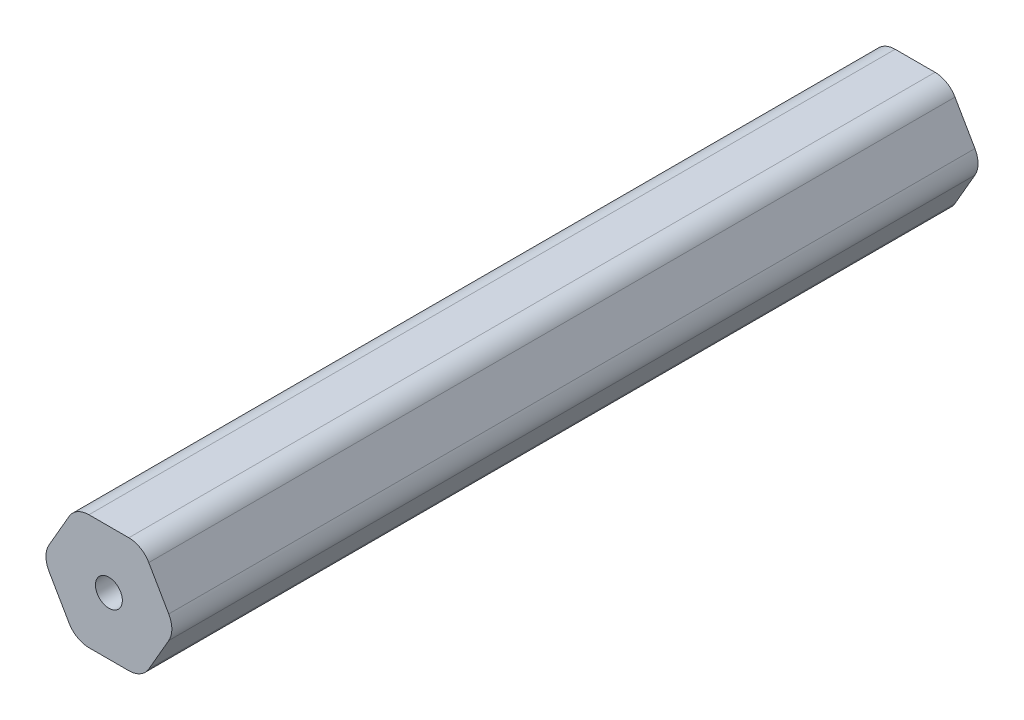
ISO-10303-21;
HEADER;
FILE_DESCRIPTION(('STEP AP214'),'2;1');
FILE_NAME('part.step','',(''),(''),'','','');
FILE_SCHEMA(('AUTOMOTIVE_DESIGN { 1 0 10303 214 1 1 1 1 }'));
ENDSEC;
DATA;
#1=APPLICATION_CONTEXT('core data for automotive mechanical design processes');
#2=APPLICATION_PROTOCOL_DEFINITION('international standard','automotive_design',2000,#1);
#3=PRODUCT_CONTEXT('',#1,'mechanical');
#4=PRODUCT('Part','Part','',(#3));
#5=PRODUCT_RELATED_PRODUCT_CATEGORY('part','',(#4));
#6=PRODUCT_DEFINITION_FORMATION('','',#4);
#7=PRODUCT_DEFINITION_CONTEXT('part definition',#1,'design');
#8=PRODUCT_DEFINITION('design','',#6,#7);
#9=PRODUCT_DEFINITION_SHAPE('','',#8);
#10=(LENGTH_UNIT() NAMED_UNIT(*) SI_UNIT(.MILLI.,.METRE.));
#11=(NAMED_UNIT(*) PLANE_ANGLE_UNIT() SI_UNIT($,.RADIAN.));
#12=(NAMED_UNIT(*) SI_UNIT($,.STERADIAN.) SOLID_ANGLE_UNIT());
#13=UNCERTAINTY_MEASURE_WITH_UNIT(LENGTH_MEASURE(1.E-05),#10,'distance_accuracy_value','');
#14=(GEOMETRIC_REPRESENTATION_CONTEXT(3) GLOBAL_UNCERTAINTY_ASSIGNED_CONTEXT((#13)) GLOBAL_UNIT_ASSIGNED_CONTEXT((#10,
#11,#12)) REPRESENTATION_CONTEXT('',''));
#15=CARTESIAN_POINT('',(0.,0.,0.));
#16=DIRECTION('',(0.,0.,1.));
#17=DIRECTION('',(1.,0.,0.));
#18=AXIS2_PLACEMENT_3D('',#15,#16,#17);
#19=CARTESIAN_POINT('',(0.,0.,88.9));
#20=DIRECTION('',(0.,0.,1.));
#21=DIRECTION('',(1.,0.,0.));
#22=AXIS2_PLACEMENT_3D('',#19,#20,#21);
#23=PLANE('',#22);
#24=DIRECTION('',(-0.499999999999995,-0.866025403784441,0.));
#25=VECTOR('',#24,1.);
#26=CARTESIAN_POINT('',(-4.72485553184145,5.89908017745911,88.9));
#27=LINE('',#26,#25);
#28=CARTESIAN_POINT('',(-5.45809037371227,4.6290801774591,88.9));
#29=VERTEX_POINT('',#28);
#30=CARTESIAN_POINT('',(-7.65779489932473,0.819080177459077,88.9));
#31=VERTEX_POINT('',#30);
#32=EDGE_CURVE('E273',#29,#31,#27,.T.);
#33=ORIENTED_EDGE('',*,*,#32,.T.);
#34=CARTESIAN_POINT('',(-5.45809037371224,-0.450919822540911,88.9));
#35=DIRECTION('',(0.,0.,1.));
#36=DIRECTION('',(1.,0.,0.));
#37=AXIS2_PLACEMENT_3D('',#34,#35,#36);
#38=CIRCLE('',#37,2.54);
#39=CARTESIAN_POINT('',(-7.65779489932471,-1.72091982254093,88.9));
#40=VERTEX_POINT('',#39);
#41=EDGE_CURVE('E210',#31,#40,#38,.T.);
#42=ORIENTED_EDGE('',*,*,#41,.T.);
#43=DIRECTION('',(0.500000000000007,-0.866025403784435,0.));
#44=VECTOR('',#43,1.);
#45=CARTESIAN_POINT('',(-8.39102974119555,-0.450919822540931,88.9));
#46=LINE('',#45,#44);
#47=CARTESIAN_POINT('',(-5.4580903737122,-5.53091982254092,88.9));
#48=VERTEX_POINT('',#47);
#49=EDGE_CURVE('E155',#40,#48,#46,.T.);
#50=ORIENTED_EDGE('',*,*,#49,.T.);
#51=CARTESIAN_POINT('',(-3.25838584809973,-4.2609198225409,88.9));
#52=DIRECTION('',(0.,0.,1.));
#53=DIRECTION('',(1.,0.,0.));
#54=AXIS2_PLACEMENT_3D('',#51,#52,#53);
#55=CIRCLE('',#54,2.54);
#56=CARTESIAN_POINT('',(-3.25838584809971,-6.8009198225409,88.9));
#57=VERTEX_POINT('',#56);
#58=EDGE_CURVE('E66',#48,#57,#55,.T.);
#59=ORIENTED_EDGE('',*,*,#58,.T.);
#60=DIRECTION('',(1.,0.,0.));
#61=VECTOR('',#60,1.);
#62=CARTESIAN_POINT('',(-4.72485553184136,-6.80091982254092,88.9));
#63=LINE('',#62,#61);
#64=CARTESIAN_POINT('',(1.14102320312526,-6.80091982254086,88.9));
#65=VERTEX_POINT('',#64);
#66=EDGE_CURVE('E177',#57,#65,#63,.T.);
#67=ORIENTED_EDGE('',*,*,#66,.T.);
#68=CARTESIAN_POINT('',(1.14102320312524,-4.26091982254086,88.9));
#69=DIRECTION('',(0.,0.,1.));
#70=DIRECTION('',(1.,0.,0.));
#71=AXIS2_PLACEMENT_3D('',#68,#69,#70);
#72=CIRCLE('',#71,2.54);
#73=CARTESIAN_POINT('',(3.34072772873772,-5.53091982254084,88.9));
#74=VERTEX_POINT('',#73);
#75=EDGE_CURVE('E202',#65,#74,#72,.T.);
#76=ORIENTED_EDGE('',*,*,#75,.T.);
#77=DIRECTION('',(0.499999999999995,0.866025403784441,0.));
#78=VECTOR('',#77,1.);
#79=CARTESIAN_POINT('',(2.60749288686691,-6.80091982254084,88.9));
#80=LINE('',#79,#78);
#81=CARTESIAN_POINT('',(5.54043225435014,-1.72091982254088,88.9));
#82=VERTEX_POINT('',#81);
#83=EDGE_CURVE('E170',#74,#82,#80,.T.);
#84=ORIENTED_EDGE('',*,*,#83,.T.);
#85=CARTESIAN_POINT('',(3.34072772873766,-0.45091982254089,88.9));
#86=DIRECTION('',(0.,0.,1.));
#87=DIRECTION('',(1.,0.,0.));
#88=AXIS2_PLACEMENT_3D('',#85,#86,#87);
#89=CIRCLE('',#88,2.54);
#90=CARTESIAN_POINT('',(5.54043225435014,0.819080177459112,88.9));
#91=VERTEX_POINT('',#90);
#92=EDGE_CURVE('E199',#82,#91,#89,.T.);
#93=ORIENTED_EDGE('',*,*,#92,.T.);
#94=DIRECTION('',(-0.500000000000001,0.866025403784438,0.));
#95=VECTOR('',#94,1.);
#96=CARTESIAN_POINT('',(6.27366709622096,-0.45091982254088,88.9));
#97=LINE('',#96,#95);
#98=CARTESIAN_POINT('',(3.34072772873765,4.62908017745913,88.9));
#99=VERTEX_POINT('',#98);
#100=EDGE_CURVE('E239',#91,#99,#97,.T.);
#101=ORIENTED_EDGE('',*,*,#100,.T.);
#102=CARTESIAN_POINT('',(1.14102320312517,3.35908017745913,88.9));
#103=DIRECTION('',(0.,0.,1.));
#104=DIRECTION('',(1.,0.,0.));
#105=AXIS2_PLACEMENT_3D('',#102,#103,#104);
#106=CIRCLE('',#105,2.54);
#107=CARTESIAN_POINT('',(1.14102320312517,5.89908017745913,88.9));
#108=VERTEX_POINT('',#107);
#109=EDGE_CURVE('E196',#99,#108,#106,.T.);
#110=ORIENTED_EDGE('',*,*,#109,.T.);
#111=DIRECTION('',(-1.,0.,0.));
#112=VECTOR('',#111,1.);
#113=CARTESIAN_POINT('',(2.60749288686682,5.89908017745913,88.9));
#114=LINE('',#113,#112);
#115=CARTESIAN_POINT('',(-3.25838584809979,5.89908017745911,88.9));
#116=VERTEX_POINT('',#115);
#117=EDGE_CURVE('E252',#108,#116,#114,.T.);
#118=ORIENTED_EDGE('',*,*,#117,.T.);
#119=CARTESIAN_POINT('',(-3.25838584809979,3.35908017745911,88.9));
#120=DIRECTION('',(0.,0.,1.));
#121=DIRECTION('',(1.,0.,0.));
#122=AXIS2_PLACEMENT_3D('',#119,#120,#121);
#123=CIRCLE('',#122,2.54);
#124=EDGE_CURVE('E207',#116,#29,#123,.T.);
#125=ORIENTED_EDGE('',*,*,#124,.T.);
#126=EDGE_LOOP('',(#33,#42,#50,#59,#67,#76,#84,#93,#101,#110,#118,#125));
#127=FACE_BOUND('',#126,.T.);
#128=CARTESIAN_POINT('',(-1.05868132248729,-0.45091982254088,88.9));
#129=DIRECTION('',(0.,0.,1.));
#130=DIRECTION('',(1.,0.,0.));
#131=AXIS2_PLACEMENT_3D('',#128,#129,#130);
#132=CIRCLE('',#131,1.48316166747767);
#133=CARTESIAN_POINT('',(0.424480344990378,-0.45091982254088,88.9));
#134=VERTEX_POINT('',#133);
#135=EDGE_CURVE('E268',#134,#134,#132,.T.);
#136=ORIENTED_EDGE('',*,*,#135,.F.);
#137=EDGE_LOOP('',(#136));
#138=FACE_BOUND('',#137,.T.);
#139=ADVANCED_FACE('F43',(#127,#138),#23,.T.);
#140=CARTESIAN_POINT('',(0.,0.,0.));
#141=DIRECTION('',(0.,0.,1.));
#142=DIRECTION('',(1.,0.,0.));
#143=AXIS2_PLACEMENT_3D('',#140,#141,#142);
#144=PLANE('',#143);
#145=DIRECTION('',(0.500000000000007,-0.866025403784435,0.));
#146=VECTOR('',#145,1.);
#147=CARTESIAN_POINT('',(-8.39102974119555,-0.450919822540931,0.));
#148=LINE('',#147,#146);
#149=CARTESIAN_POINT('',(-7.65779489932471,-1.72091982254093,0.));
#150=VERTEX_POINT('',#149);
#151=CARTESIAN_POINT('',(-5.4580903737122,-5.53091982254092,0.));
#152=VERTEX_POINT('',#151);
#153=EDGE_CURVE('E153',#150,#152,#148,.T.);
#154=ORIENTED_EDGE('',*,*,#153,.F.);
#155=CARTESIAN_POINT('',(-5.45809037371224,-0.450919822540911,0.));
#156=DIRECTION('',(0.,0.,1.));
#157=DIRECTION('',(1.,0.,0.));
#158=AXIS2_PLACEMENT_3D('',#155,#156,#157);
#159=CIRCLE('',#158,2.54);
#160=CARTESIAN_POINT('',(-7.65779489932473,0.819080177459077,0.));
#161=VERTEX_POINT('',#160);
#162=EDGE_CURVE('E135',#150,#161,#159,.F.);
#163=ORIENTED_EDGE('',*,*,#162,.T.);
#164=DIRECTION('',(-0.499999999999995,-0.866025403784441,0.));
#165=VECTOR('',#164,1.);
#166=CARTESIAN_POINT('',(-4.72485553184145,5.89908017745911,0.));
#167=LINE('',#166,#165);
#168=CARTESIAN_POINT('',(-5.45809037371227,4.6290801774591,0.));
#169=VERTEX_POINT('',#168);
#170=EDGE_CURVE('E166',#169,#161,#167,.T.);
#171=ORIENTED_EDGE('',*,*,#170,.F.);
#172=CARTESIAN_POINT('',(-3.25838584809979,3.35908017745911,0.));
#173=DIRECTION('',(0.,0.,1.));
#174=DIRECTION('',(1.,0.,0.));
#175=AXIS2_PLACEMENT_3D('',#172,#173,#174);
#176=CIRCLE('',#175,2.54);
#177=CARTESIAN_POINT('',(-3.25838584809979,5.89908017745911,0.));
#178=VERTEX_POINT('',#177);
#179=EDGE_CURVE('E147',#169,#178,#176,.F.);
#180=ORIENTED_EDGE('',*,*,#179,.T.);
#181=DIRECTION('',(-1.,0.,0.));
#182=VECTOR('',#181,1.);
#183=CARTESIAN_POINT('',(2.60749288686682,5.89908017745913,0.));
#184=LINE('',#183,#182);
#185=CARTESIAN_POINT('',(1.14102320312517,5.89908017745913,0.));
#186=VERTEX_POINT('',#185);
#187=EDGE_CURVE('E172',#186,#178,#184,.T.);
#188=ORIENTED_EDGE('',*,*,#187,.F.);
#189=CARTESIAN_POINT('',(1.14102320312517,3.35908017745913,0.));
#190=DIRECTION('',(0.,0.,1.));
#191=DIRECTION('',(1.,0.,0.));
#192=AXIS2_PLACEMENT_3D('',#189,#190,#191);
#193=CIRCLE('',#192,2.54);
#194=CARTESIAN_POINT('',(3.34072772873765,4.62908017745913,0.));
#195=VERTEX_POINT('',#194);
#196=EDGE_CURVE('E157',#186,#195,#193,.F.);
#197=ORIENTED_EDGE('',*,*,#196,.T.);
#198=DIRECTION('',(-0.500000000000001,0.866025403784438,0.));
#199=VECTOR('',#198,1.);
#200=CARTESIAN_POINT('',(6.27366709622096,-0.45091982254088,0.));
#201=LINE('',#200,#199);
#202=CARTESIAN_POINT('',(5.54043225435014,0.819080177459112,0.));
#203=VERTEX_POINT('',#202);
#204=EDGE_CURVE('E242',#203,#195,#201,.T.);
#205=ORIENTED_EDGE('',*,*,#204,.F.);
#206=CARTESIAN_POINT('',(3.34072772873766,-0.45091982254089,0.));
#207=DIRECTION('',(0.,0.,1.));
#208=DIRECTION('',(1.,0.,0.));
#209=AXIS2_PLACEMENT_3D('',#206,#207,#208);
#210=CIRCLE('',#209,2.54);
#211=CARTESIAN_POINT('',(5.54043225435014,-1.72091982254088,0.));
#212=VERTEX_POINT('',#211);
#213=EDGE_CURVE('E181',#203,#212,#210,.F.);
#214=ORIENTED_EDGE('',*,*,#213,.T.);
#215=DIRECTION('',(0.499999999999995,0.866025403784441,0.));
#216=VECTOR('',#215,1.);
#217=CARTESIAN_POINT('',(2.60749288686691,-6.80091982254084,0.));
#218=LINE('',#217,#216);
#219=CARTESIAN_POINT('',(3.34072772873772,-5.53091982254084,0.));
#220=VERTEX_POINT('',#219);
#221=EDGE_CURVE('E262',#220,#212,#218,.T.);
#222=ORIENTED_EDGE('',*,*,#221,.F.);
#223=CARTESIAN_POINT('',(1.14102320312524,-4.26091982254086,0.));
#224=DIRECTION('',(0.,0.,1.));
#225=DIRECTION('',(1.,0.,0.));
#226=AXIS2_PLACEMENT_3D('',#223,#224,#225);
#227=CIRCLE('',#226,2.54);
#228=CARTESIAN_POINT('',(1.14102320312526,-6.80091982254086,0.));
#229=VERTEX_POINT('',#228);
#230=EDGE_CURVE('E184',#220,#229,#227,.F.);
#231=ORIENTED_EDGE('',*,*,#230,.T.);
#232=DIRECTION('',(1.,0.,0.));
#233=VECTOR('',#232,1.);
#234=CARTESIAN_POINT('',(-4.72485553184136,-6.80091982254092,0.));
#235=LINE('',#234,#233);
#236=CARTESIAN_POINT('',(-3.25838584809971,-6.8009198225409,0.));
#237=VERTEX_POINT('',#236);
#238=EDGE_CURVE('E165',#237,#229,#235,.T.);
#239=ORIENTED_EDGE('',*,*,#238,.F.);
#240=CARTESIAN_POINT('',(-3.25838584809973,-4.2609198225409,0.));
#241=DIRECTION('',(0.,0.,1.));
#242=DIRECTION('',(1.,0.,0.));
#243=AXIS2_PLACEMENT_3D('',#240,#241,#242);
#244=CIRCLE('',#243,2.54);
#245=EDGE_CURVE('E163',#237,#152,#244,.F.);
#246=ORIENTED_EDGE('',*,*,#245,.T.);
#247=EDGE_LOOP('',(#154,#163,#171,#180,#188,#197,#205,#214,#222,#231,#239,#246));
#248=FACE_BOUND('',#247,.T.);
#249=CARTESIAN_POINT('',(-1.05868132248729,-0.45091982254088,0.));
#250=DIRECTION('',(0.,0.,1.));
#251=DIRECTION('',(1.,0.,0.));
#252=AXIS2_PLACEMENT_3D('',#249,#250,#251);
#253=CIRCLE('',#252,1.48316166747767);
#254=CARTESIAN_POINT('',(0.424480344990378,-0.45091982254088,0.));
#255=VERTEX_POINT('',#254);
#256=EDGE_CURVE('E280',#255,#255,#253,.T.);
#257=ORIENTED_EDGE('',*,*,#256,.T.);
#258=EDGE_LOOP('',(#257));
#259=FACE_BOUND('',#258,.T.);
#260=ADVANCED_FACE('F160',(#248,#259),#144,.F.);
#261=CARTESIAN_POINT('',(2.60749288686691,-6.80091982254084,88.9));
#262=DIRECTION('',(-0.866025403784441,0.499999999999995,0.));
#263=DIRECTION('',(-0.499999999999995,-0.866025403784441,0.));
#264=AXIS2_PLACEMENT_3D('',#261,#262,#263);
#265=PLANE('',#264);
#266=ORIENTED_EDGE('',*,*,#83,.F.);
#267=DIRECTION('',(0.,0.,-1.));
#268=VECTOR('',#267,1.);
#269=CARTESIAN_POINT('',(3.34072772873772,-5.53091982254084,88.9));
#270=LINE('',#269,#268);
#271=EDGE_CURVE('E229',#74,#220,#270,.T.);
#272=ORIENTED_EDGE('',*,*,#271,.T.);
#273=ORIENTED_EDGE('',*,*,#221,.T.);
#274=DIRECTION('',(0.,0.,-1.));
#275=VECTOR('',#274,1.);
#276=CARTESIAN_POINT('',(5.54043225435014,-1.72091982254088,88.9));
#277=LINE('',#276,#275);
#278=EDGE_CURVE('E226',#212,#82,#277,.F.);
#279=ORIENTED_EDGE('',*,*,#278,.T.);
#280=EDGE_LOOP('',(#266,#272,#273,#279));
#281=FACE_BOUND('',#280,.T.);
#282=ADVANCED_FACE('F295',(#281),#265,.F.);
#283=CARTESIAN_POINT('',(6.27366709622096,-0.45091982254088,88.9));
#284=DIRECTION('',(-0.866025403784438,-0.500000000000001,0.));
#285=DIRECTION('',(0.500000000000001,-0.866025403784438,0.));
#286=AXIS2_PLACEMENT_3D('',#283,#284,#285);
#287=PLANE('',#286);
#288=ORIENTED_EDGE('',*,*,#100,.F.);
#289=DIRECTION('',(0.,0.,-1.));
#290=VECTOR('',#289,1.);
#291=CARTESIAN_POINT('',(5.54043225435014,0.819080177459112,88.9));
#292=LINE('',#291,#290);
#293=EDGE_CURVE('E11',#91,#203,#292,.T.);
#294=ORIENTED_EDGE('',*,*,#293,.T.);
#295=ORIENTED_EDGE('',*,*,#204,.T.);
#296=DIRECTION('',(0.,0.,-1.));
#297=VECTOR('',#296,1.);
#298=CARTESIAN_POINT('',(3.34072772873765,4.62908017745913,88.9));
#299=LINE('',#298,#297);
#300=EDGE_CURVE('E52',#195,#99,#299,.F.);
#301=ORIENTED_EDGE('',*,*,#300,.T.);
#302=EDGE_LOOP('',(#288,#294,#295,#301));
#303=FACE_BOUND('',#302,.T.);
#304=ADVANCED_FACE('F238',(#303),#287,.F.);
#305=CARTESIAN_POINT('',(2.60749288686682,5.89908017745913,88.9));
#306=DIRECTION('',(0.,-1.,0.));
#307=DIRECTION('',(1.,0.,0.));
#308=AXIS2_PLACEMENT_3D('',#305,#306,#307);
#309=PLANE('',#308);
#310=ORIENTED_EDGE('',*,*,#187,.T.);
#311=DIRECTION('',(0.,0.,-1.));
#312=VECTOR('',#311,1.);
#313=CARTESIAN_POINT('',(-3.25838584809979,5.89908017745911,88.9));
#314=LINE('',#313,#312);
#315=EDGE_CURVE('E217',#178,#116,#314,.F.);
#316=ORIENTED_EDGE('',*,*,#315,.T.);
#317=ORIENTED_EDGE('',*,*,#117,.F.);
#318=DIRECTION('',(0.,0.,-1.));
#319=VECTOR('',#318,1.);
#320=CARTESIAN_POINT('',(1.14102320312517,5.89908017745913,88.9));
#321=LINE('',#320,#319);
#322=EDGE_CURVE('E213',#108,#186,#321,.T.);
#323=ORIENTED_EDGE('',*,*,#322,.T.);
#324=EDGE_LOOP('',(#310,#316,#317,#323));
#325=FACE_BOUND('',#324,.T.);
#326=ADVANCED_FACE('F258',(#325),#309,.F.);
#327=CARTESIAN_POINT('',(-4.72485553184145,5.89908017745911,88.9));
#328=DIRECTION('',(0.866025403784442,-0.499999999999995,0.));
#329=DIRECTION('',(0.499999999999995,0.866025403784442,0.));
#330=AXIS2_PLACEMENT_3D('',#327,#328,#329);
#331=PLANE('',#330);
#332=ORIENTED_EDGE('',*,*,#170,.T.);
#333=DIRECTION('',(0.,0.,-1.));
#334=VECTOR('',#333,1.);
#335=CARTESIAN_POINT('',(-7.65779489932473,0.819080177459076,88.9));
#336=LINE('',#335,#334);
#337=EDGE_CURVE('E140',#161,#31,#336,.F.);
#338=ORIENTED_EDGE('',*,*,#337,.T.);
#339=ORIENTED_EDGE('',*,*,#32,.F.);
#340=DIRECTION('',(0.,0.,-1.));
#341=VECTOR('',#340,1.);
#342=CARTESIAN_POINT('',(-5.45809037371227,4.6290801774591,88.9));
#343=LINE('',#342,#341);
#344=EDGE_CURVE('E146',#29,#169,#343,.T.);
#345=ORIENTED_EDGE('',*,*,#344,.T.);
#346=EDGE_LOOP('',(#332,#338,#339,#345));
#347=FACE_BOUND('',#346,.T.);
#348=ADVANCED_FACE('F304',(#347),#331,.F.);
#349=CARTESIAN_POINT('',(-8.39102974119555,-0.450919822540931,88.9));
#350=DIRECTION('',(0.866025403784435,0.500000000000007,0.));
#351=DIRECTION('',(-0.500000000000007,0.866025403784435,0.));
#352=AXIS2_PLACEMENT_3D('',#349,#350,#351);
#353=PLANE('',#352);
#354=ORIENTED_EDGE('',*,*,#49,.F.);
#355=DIRECTION('',(0.,0.,-1.));
#356=VECTOR('',#355,1.);
#357=CARTESIAN_POINT('',(-7.65779489932471,-1.72091982254093,88.9));
#358=LINE('',#357,#356);
#359=EDGE_CURVE('E139',#40,#150,#358,.T.);
#360=ORIENTED_EDGE('',*,*,#359,.T.);
#361=ORIENTED_EDGE('',*,*,#153,.T.);
#362=DIRECTION('',(0.,0.,-1.));
#363=VECTOR('',#362,1.);
#364=CARTESIAN_POINT('',(-5.4580903737122,-5.53091982254092,88.9));
#365=LINE('',#364,#363);
#366=EDGE_CURVE('E158',#152,#48,#365,.F.);
#367=ORIENTED_EDGE('',*,*,#366,.T.);
#368=EDGE_LOOP('',(#354,#360,#361,#367));
#369=FACE_BOUND('',#368,.T.);
#370=ADVANCED_FACE('F152',(#369),#353,.F.);
#371=CARTESIAN_POINT('',(-4.72485553184136,-6.80091982254092,88.9));
#372=DIRECTION('',(0.,1.,0.));
#373=DIRECTION('',(-1.,0.,0.));
#374=AXIS2_PLACEMENT_3D('',#371,#372,#373);
#375=PLANE('',#374);
#376=ORIENTED_EDGE('',*,*,#66,.F.);
#377=DIRECTION('',(0.,0.,-1.));
#378=VECTOR('',#377,1.);
#379=CARTESIAN_POINT('',(-3.25838584809971,-6.8009198225409,88.9));
#380=LINE('',#379,#378);
#381=EDGE_CURVE('E222',#57,#237,#380,.T.);
#382=ORIENTED_EDGE('',*,*,#381,.T.);
#383=ORIENTED_EDGE('',*,*,#238,.T.);
#384=DIRECTION('',(0.,0.,-1.));
#385=VECTOR('',#384,1.);
#386=CARTESIAN_POINT('',(1.14102320312526,-6.80091982254086,88.9));
#387=LINE('',#386,#385);
#388=EDGE_CURVE('E59',#229,#65,#387,.F.);
#389=ORIENTED_EDGE('',*,*,#388,.T.);
#390=EDGE_LOOP('',(#376,#382,#383,#389));
#391=FACE_BOUND('',#390,.T.);
#392=ADVANCED_FACE('F299',(#391),#375,.F.);
#393=CARTESIAN_POINT('',(-1.05868132248729,-0.45091982254088,88.9));
#394=DIRECTION('',(0.,0.,-1.));
#395=DIRECTION('',(-1.,0.,0.));
#396=AXIS2_PLACEMENT_3D('',#393,#394,#395);
#397=CYLINDRICAL_SURFACE('',#396,1.48316166747767);
#398=ORIENTED_EDGE('',*,*,#135,.T.);
#399=EDGE_LOOP('',(#398));
#400=FACE_BOUND('',#399,.T.);
#401=ORIENTED_EDGE('',*,*,#256,.F.);
#402=EDGE_LOOP('',(#401));
#403=FACE_BOUND('',#402,.T.);
#404=ADVANCED_FACE('F288',(#400,#403),#397,.F.);
#405=CARTESIAN_POINT('',(-5.45809037371224,-0.450919822540911,88.9));
#406=DIRECTION('',(0.,0.,-1.));
#407=DIRECTION('',(-1.,0.,0.));
#408=AXIS2_PLACEMENT_3D('',#405,#406,#407);
#409=CYLINDRICAL_SURFACE('',#408,2.54);
#410=ORIENTED_EDGE('',*,*,#41,.F.);
#411=ORIENTED_EDGE('',*,*,#337,.F.);
#412=ORIENTED_EDGE('',*,*,#162,.F.);
#413=ORIENTED_EDGE('',*,*,#359,.F.);
#414=EDGE_LOOP('',(#410,#411,#412,#413));
#415=FACE_BOUND('',#414,.T.);
#416=ADVANCED_FACE('F138',(#415),#409,.T.);
#417=CARTESIAN_POINT('',(-3.25838584809979,3.35908017745911,88.9));
#418=DIRECTION('',(0.,0.,-1.));
#419=DIRECTION('',(-1.,0.,0.));
#420=AXIS2_PLACEMENT_3D('',#417,#418,#419);
#421=CYLINDRICAL_SURFACE('',#420,2.54);
#422=ORIENTED_EDGE('',*,*,#124,.F.);
#423=ORIENTED_EDGE('',*,*,#315,.F.);
#424=ORIENTED_EDGE('',*,*,#179,.F.);
#425=ORIENTED_EDGE('',*,*,#344,.F.);
#426=EDGE_LOOP('',(#422,#423,#424,#425));
#427=FACE_BOUND('',#426,.T.);
#428=ADVANCED_FACE('F317',(#427),#421,.T.);
#429=CARTESIAN_POINT('',(-3.25838584809973,-4.2609198225409,88.9));
#430=DIRECTION('',(0.,0.,-1.));
#431=DIRECTION('',(-1.,0.,0.));
#432=AXIS2_PLACEMENT_3D('',#429,#430,#431);
#433=CYLINDRICAL_SURFACE('',#432,2.54);
#434=ORIENTED_EDGE('',*,*,#58,.F.);
#435=ORIENTED_EDGE('',*,*,#366,.F.);
#436=ORIENTED_EDGE('',*,*,#245,.F.);
#437=ORIENTED_EDGE('',*,*,#381,.F.);
#438=EDGE_LOOP('',(#434,#435,#436,#437));
#439=FACE_BOUND('',#438,.T.);
#440=ADVANCED_FACE('F320',(#439),#433,.T.);
#441=CARTESIAN_POINT('',(1.14102320312524,-4.26091982254086,88.9));
#442=DIRECTION('',(0.,0.,-1.));
#443=DIRECTION('',(-1.,0.,0.));
#444=AXIS2_PLACEMENT_3D('',#441,#442,#443);
#445=CYLINDRICAL_SURFACE('',#444,2.54);
#446=ORIENTED_EDGE('',*,*,#75,.F.);
#447=ORIENTED_EDGE('',*,*,#388,.F.);
#448=ORIENTED_EDGE('',*,*,#230,.F.);
#449=ORIENTED_EDGE('',*,*,#271,.F.);
#450=EDGE_LOOP('',(#446,#447,#448,#449));
#451=FACE_BOUND('',#450,.T.);
#452=ADVANCED_FACE('F324',(#451),#445,.T.);
#453=CARTESIAN_POINT('',(3.34072772873766,-0.45091982254089,88.9));
#454=DIRECTION('',(0.,0.,-1.));
#455=DIRECTION('',(-1.,0.,0.));
#456=AXIS2_PLACEMENT_3D('',#453,#454,#455);
#457=CYLINDRICAL_SURFACE('',#456,2.54);
#458=ORIENTED_EDGE('',*,*,#92,.F.);
#459=ORIENTED_EDGE('',*,*,#278,.F.);
#460=ORIENTED_EDGE('',*,*,#213,.F.);
#461=ORIENTED_EDGE('',*,*,#293,.F.);
#462=EDGE_LOOP('',(#458,#459,#460,#461));
#463=FACE_BOUND('',#462,.T.);
#464=ADVANCED_FACE('F327',(#463),#457,.T.);
#465=CARTESIAN_POINT('',(1.14102320312517,3.35908017745913,88.9));
#466=DIRECTION('',(0.,0.,-1.));
#467=DIRECTION('',(-1.,0.,0.));
#468=AXIS2_PLACEMENT_3D('',#465,#466,#467);
#469=CYLINDRICAL_SURFACE('',#468,2.54);
#470=ORIENTED_EDGE('',*,*,#109,.F.);
#471=ORIENTED_EDGE('',*,*,#300,.F.);
#472=ORIENTED_EDGE('',*,*,#196,.F.);
#473=ORIENTED_EDGE('',*,*,#322,.F.);
#474=EDGE_LOOP('',(#470,#471,#472,#473));
#475=FACE_BOUND('',#474,.T.);
#476=ADVANCED_FACE('F45',(#475),#469,.T.);
#477=CLOSED_SHELL('',(#139,#260,#282,#304,#326,#348,#370,#392,#404,#416,#428,#440,#452,#464,#476));
#478=MANIFOLD_SOLID_BREP('B2',#477);
#479=ADVANCED_BREP_SHAPE_REPRESENTATION('',(#18,#478),#14);
#480=SHAPE_DEFINITION_REPRESENTATION(#9,#479);
ENDSEC;
END-ISO-10303-21;
